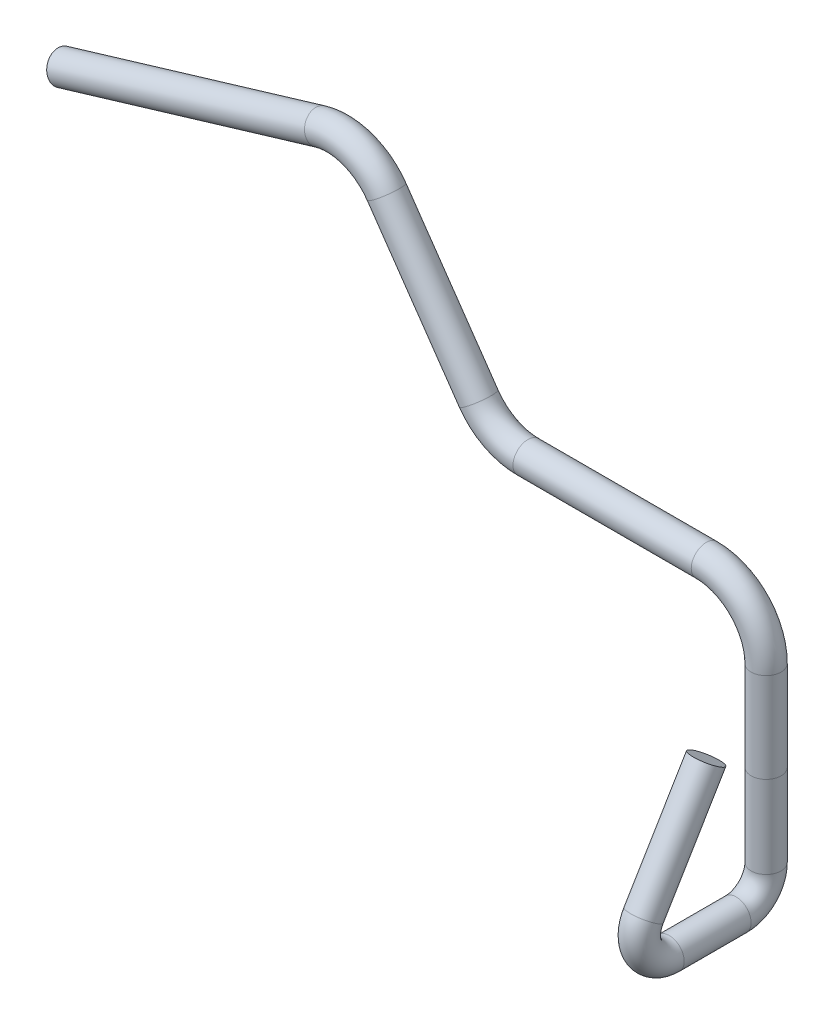
ISO-10303-21;
HEADER;
FILE_DESCRIPTION(('STEP AP214'),'2;1');
FILE_NAME('part.step','',(''),(''),'','','');
FILE_SCHEMA(('AUTOMOTIVE_DESIGN { 1 0 10303 214 1 1 1 1 }'));
ENDSEC;
DATA;
#1=APPLICATION_CONTEXT('core data for automotive mechanical design processes');
#2=APPLICATION_PROTOCOL_DEFINITION('international standard','automotive_design',2000,#1);
#3=PRODUCT_CONTEXT('',#1,'mechanical');
#4=PRODUCT('Part','Part','',(#3));
#5=PRODUCT_RELATED_PRODUCT_CATEGORY('part','',(#4));
#6=PRODUCT_DEFINITION_FORMATION('','',#4);
#7=PRODUCT_DEFINITION_CONTEXT('part definition',#1,'design');
#8=PRODUCT_DEFINITION('design','',#6,#7);
#9=PRODUCT_DEFINITION_SHAPE('','',#8);
#10=(LENGTH_UNIT() NAMED_UNIT(*) SI_UNIT(.MILLI.,.METRE.));
#11=(NAMED_UNIT(*) PLANE_ANGLE_UNIT() SI_UNIT($,.RADIAN.));
#12=(NAMED_UNIT(*) SI_UNIT($,.STERADIAN.) SOLID_ANGLE_UNIT());
#13=UNCERTAINTY_MEASURE_WITH_UNIT(LENGTH_MEASURE(1.E-05),#10,'distance_accuracy_value','');
#14=(GEOMETRIC_REPRESENTATION_CONTEXT(3) GLOBAL_UNCERTAINTY_ASSIGNED_CONTEXT((#13)) GLOBAL_UNIT_ASSIGNED_CONTEXT((#10,
#11,#12)) REPRESENTATION_CONTEXT('',''));
#15=CARTESIAN_POINT('',(0.,0.,0.));
#16=DIRECTION('',(0.,0.,1.));
#17=DIRECTION('',(1.,0.,0.));
#18=AXIS2_PLACEMENT_3D('',#15,#16,#17);
#19=CARTESIAN_POINT('',(-119.38,43.18,0.));
#20=DIRECTION('',(-0.957826285221151,-0.287347885566345,0.));
#21=DIRECTION('',(0.,0.,1.));
#22=AXIS2_PLACEMENT_3D('',#19,#20,#21);
#23=PLANE('',#22);
#24=CARTESIAN_POINT('',(-119.38,43.18,0.));
#25=DIRECTION('',(-0.957826285221151,-0.287347885566345,0.));
#26=DIRECTION('',(0.,0.,1.));
#27=AXIS2_PLACEMENT_3D('',#24,#25,#26);
#28=CIRCLE('',#27,2.54);
#29=CARTESIAN_POINT('',(-120.109863629338,45.6128787644617,0.));
#30=VERTEX_POINT('',#29);
#31=EDGE_CURVE('E118',#30,#30,#28,.T.);
#32=ORIENTED_EDGE('',*,*,#31,.T.);
#33=EDGE_LOOP('',(#32));
#34=FACE_BOUND('',#33,.T.);
#35=ADVANCED_FACE('F61',(#34),#23,.T.);
#36=CARTESIAN_POINT('',(0.,6.35,10.16));
#37=DIRECTION('',(0.,-0.857492925712544,0.514495755427527));
#38=DIRECTION('',(0.,-0.514495755427527,-0.857492925712544));
#39=AXIS2_PLACEMENT_3D('',#36,#37,#38);
#40=PLANE('',#39);
#41=CARTESIAN_POINT('',(0.,6.35,10.16));
#42=DIRECTION('',(0.,-0.857492925712544,0.514495755427527));
#43=DIRECTION('',(0.,-0.514495755427527,-0.857492925712544));
#44=AXIS2_PLACEMENT_3D('',#41,#42,#43);
#45=CIRCLE('',#44,2.54);
#46=CARTESIAN_POINT('',(0.,5.04318078121408,7.98196796869014));
#47=VERTEX_POINT('',#46);
#48=EDGE_CURVE('E11',#47,#47,#45,.T.);
#49=ORIENTED_EDGE('',*,*,#48,.F.);
#50=EDGE_LOOP('',(#49));
#51=FACE_BOUND('',#50,.T.);
#52=ADVANCED_FACE('F128',(#51),#40,.F.);
#53=CARTESIAN_POINT('',(-119.38,43.18,0.));
#54=DIRECTION('',(0.957826285221151,0.287347885566345,0.));
#55=DIRECTION('',(-0.287347885566345,0.957826285221151,0.));
#56=AXIS2_PLACEMENT_3D('',#53,#54,#55);
#57=CYLINDRICAL_SURFACE('',#56,2.54);
#58=CARTESIAN_POINT('',(-75.6508903402252,56.2987328979324,0.));
#59=DIRECTION('',(-0.957826285221151,-0.287347885566345,0.));
#60=DIRECTION('',(0.,0.,1.));
#61=AXIS2_PLACEMENT_3D('',#58,#59,#60);
#62=CIRCLE('',#61,2.54);
#63=CARTESIAN_POINT('',(-76.3807539695637,58.7316116623942,0.));
#64=VERTEX_POINT('',#63);
#65=EDGE_CURVE('E114',#64,#64,#62,.T.);
#66=CARTESIAN_POINT('',(-76.3807539695637,58.7316116623942,0.));
#67=CARTESIAN_POINT('',(-76.8362655285197,58.5949581947074,0.));
#68=CARTESIAN_POINT('',(-77.2917770874757,58.4583047270206,0.));
#69=CARTESIAN_POINT('',(-78.2028002053877,58.184997791647,0.));
#70=CARTESIAN_POINT('',(-78.6583117643437,58.0483443239602,0.));
#71=CARTESIAN_POINT('',(-79.5693348822556,57.7750373885866,0.));
#72=CARTESIAN_POINT('',(-80.0248464412116,57.6383839208998,0.));
#73=CARTESIAN_POINT('',(-80.9358695591236,57.3650769855262,0.));
#74=CARTESIAN_POINT('',(-81.3913811180796,57.2284235178394,0.));
#75=CARTESIAN_POINT('',(-82.3024042359915,56.9551165824658,0.));
#76=CARTESIAN_POINT('',(-82.7579157949475,56.818463114779,0.));
#77=CARTESIAN_POINT('',(-83.6689389128595,56.5451561794054,0.));
#78=CARTESIAN_POINT('',(-84.1244504718155,56.4085027117186,0.));
#79=CARTESIAN_POINT('',(-85.0354735897275,56.135195776345,0.));
#80=CARTESIAN_POINT('',(-85.4909851486835,55.9985423086582,0.));
#81=CARTESIAN_POINT('',(-86.4020082665954,55.7252353732847,0.));
#82=CARTESIAN_POINT('',(-86.8575198255514,55.5885819055978,0.));
#83=CARTESIAN_POINT('',(-87.7685429434634,55.3152749702243,0.));
#84=CARTESIAN_POINT('',(-88.2240545024194,55.1786215025375,0.));
#85=CARTESIAN_POINT('',(-89.1350776203313,54.9053145671639,0.));
#86=CARTESIAN_POINT('',(-89.5905891792873,54.7686610994771,0.));
#87=CARTESIAN_POINT('',(-90.5016122971993,54.4953541641035,0.));
#88=CARTESIAN_POINT('',(-90.9571238561553,54.3587006964167,0.));
#89=CARTESIAN_POINT('',(-91.8681469740673,54.0853937610431,0.));
#90=CARTESIAN_POINT('',(-92.3236585330233,53.9487402933563,0.));
#91=CARTESIAN_POINT('',(-93.2346816509352,53.6754333579827,0.));
#92=CARTESIAN_POINT('',(-93.6901932098912,53.5387798902959,0.));
#93=CARTESIAN_POINT('',(-94.6012163278032,53.2654729549223,0.));
#94=CARTESIAN_POINT('',(-95.0567278867592,53.1288194872355,0.));
#95=CARTESIAN_POINT('',(-95.9677510046712,52.8555125518619,0.));
#96=CARTESIAN_POINT('',(-96.4232625636271,52.7188590841751,0.));
#97=CARTESIAN_POINT('',(-97.3342856815391,52.4455521488015,0.));
#98=CARTESIAN_POINT('',(-97.7897972404951,52.3088986811147,0.));
#99=CARTESIAN_POINT('',(-98.7008203584071,52.0355917457412,0.));
#100=CARTESIAN_POINT('',(-99.1563319173631,51.8989382780544,0.));
#101=CARTESIAN_POINT('',(-100.067355035275,51.6256313426808,0.));
#102=CARTESIAN_POINT('',(-100.522866594231,51.488977874994,0.));
#103=CARTESIAN_POINT('',(-101.433889712143,51.2156709396204,0.));
#104=CARTESIAN_POINT('',(-101.889401271099,51.0790174719336,0.));
#105=CARTESIAN_POINT('',(-102.800424389011,50.80571053656,0.));
#106=CARTESIAN_POINT('',(-103.255935947967,50.6690570688732,0.));
#107=CARTESIAN_POINT('',(-104.166959065879,50.3957501334996,0.));
#108=CARTESIAN_POINT('',(-104.622470624835,50.2590966658128,0.));
#109=CARTESIAN_POINT('',(-105.533493742747,49.9857897304392,0.));
#110=CARTESIAN_POINT('',(-105.989005301703,49.8491362627524,0.));
#111=CARTESIAN_POINT('',(-106.900028419615,49.5758293273788,0.));
#112=CARTESIAN_POINT('',(-107.355539978571,49.439175859692,0.));
#113=CARTESIAN_POINT('',(-108.266563096483,49.1658689243184,0.));
#114=CARTESIAN_POINT('',(-108.722074655439,49.0292154566316,0.));
#115=CARTESIAN_POINT('',(-109.633097773351,48.755908521258,0.));
#116=CARTESIAN_POINT('',(-110.088609332307,48.6192550535712,0.));
#117=CARTESIAN_POINT('',(-110.999632450219,48.3459481181977,0.));
#118=CARTESIAN_POINT('',(-111.455144009175,48.2092946505109,0.));
#119=CARTESIAN_POINT('',(-112.366167127087,47.9359877151373,0.));
#120=CARTESIAN_POINT('',(-112.821678686043,47.7993342474505,0.));
#121=CARTESIAN_POINT('',(-113.732701803955,47.5260273120769,0.));
#122=CARTESIAN_POINT('',(-114.188213362911,47.3893738443901,0.));
#123=CARTESIAN_POINT('',(-115.099236480823,47.1160669090165,0.));
#124=CARTESIAN_POINT('',(-115.554748039779,46.9794134413297,0.));
#125=CARTESIAN_POINT('',(-116.465771157691,46.7061065059561,0.));
#126=CARTESIAN_POINT('',(-116.921282716647,46.5694530382693,0.));
#127=CARTESIAN_POINT('',(-117.832305834559,46.2961461028957,0.));
#128=CARTESIAN_POINT('',(-118.287817393515,46.1594926352089,0.));
#129=CARTESIAN_POINT('',(-119.198840511427,45.8861856998353,0.));
#130=CARTESIAN_POINT('',(-119.654352070383,45.7495322321485,0.));
#131=CARTESIAN_POINT('',(-120.109863629338,45.6128787644617,0.));
#132=B_SPLINE_CURVE_WITH_KNOTS('',3,(#66,#67,#68,#69,#70,#71,#72,#73,#74,#75,#76,#77,#78,#79,
#80,#81,#82,#83,#84,#85,#86,#87,#88,#89,#90,#91,#92,#93,#94,#95,#96,#97,#98,#99,#100,#101,#102,
#103,#104,#105,#106,#107,#108,#109,#110,#111,#112,#113,#114,#115,#116,#117,#118,#119,#120,#121,
#122,#123,#124,#125,#126,#127,#128,#129,#130,#131),.UNSPECIFIED.,.F.,.F.,(4,2,2,2,2,2,2,2,2,2,2,
2,2,2,2,2,2,2,2,2,2,2,2,2,2,2,2,2,2,2,2,2,4),(0.,1.42670408815566,2.85340817631132,
4.28011226446697,5.70681635262263,7.13352044077829,8.56022452893394,9.9869286170896,
11.4136327052453,12.8403367934009,14.2670408815566,15.6937449697122,17.1204490578679,
18.5471531460235,19.9738572341792,21.4005613223348,22.8272654104905,24.2539694986462,
25.6806735868018,27.1073776749575,28.5340817631131,29.9607858512688,31.3874899394244,
32.8141940275801,34.2408981157358,35.6676022038914,37.0943062920471,38.5210103802027,
39.9477144683584,41.374418556514,42.8011226446697,44.2278267328253,45.654530820981),.UNSPECIFIED.);
#133=EDGE_CURVE('BSEAM125',#64,#30,#132,.T.);
#134=ORIENTED_EDGE('',*,*,#65,.T.);
#135=ORIENTED_EDGE('',*,*,#31,.F.);
#136=ORIENTED_EDGE('',*,*,#133,.T.);
#137=ORIENTED_EDGE('',*,*,#133,.F.);
#138=EDGE_LOOP('',(#134,#136,#135,#137));
#139=FACE_BOUND('',#138,.T.);
#140=ADVANCED_FACE('F125',(#139),#57,.T.);
#141=CARTESIAN_POINT('',(-72.7314358228711,46.5672178400856,0.));
#142=DIRECTION('',(0.,0.,-1.));
#143=DIRECTION('',(-1.,0.,0.));
#144=AXIS2_PLACEMENT_3D('',#141,#142,#143);
#145=TOROIDAL_SURFACE('',#144,10.16,2.54);
#146=CARTESIAN_POINT('',(-64.3779631557703,52.3503912250014,0.));
#147=DIRECTION('',(-0.569209978830304,0.822192191643782,0.));
#148=DIRECTION('',(0.,0.,1.));
#149=AXIS2_PLACEMENT_3D('',#146,#147,#148);
#150=CIRCLE('',#149,2.54);
#151=CARTESIAN_POINT('',(-62.289594988995,53.7961845712304,0.));
#152=VERTEX_POINT('',#151);
#153=EDGE_CURVE('E110',#152,#152,#150,.T.);
#154=CARTESIAN_POINT('',(-72.7314358228711,46.5672178400856,0.));
#155=DIRECTION('',(0.,0.,-1.));
#156=DIRECTION('',(-1.,0.,0.));
#157=AXIS2_PLACEMENT_3D('',#154,#155,#156);
#158=CIRCLE('',#157,12.7);
#159=EDGE_CURVE('',#64,#152,#158,.T.);
#160=ORIENTED_EDGE('',*,*,#65,.F.);
#161=ORIENTED_EDGE('',*,*,#153,.T.);
#162=ORIENTED_EDGE('',*,*,#159,.T.);
#163=ORIENTED_EDGE('',*,*,#159,.F.);
#164=EDGE_LOOP('',(#160,#162,#161,#163));
#165=FACE_BOUND('',#164,.T.);
#166=ADVANCED_FACE('F127',(#165),#145,.T.);
#167=CARTESIAN_POINT('',(-64.3779631557703,52.3503912250014,0.));
#168=DIRECTION('',(0.569209978830309,-0.822192191643778,0.));
#169=DIRECTION('',(0.822192191643778,0.569209978830309,0.));
#170=AXIS2_PLACEMENT_3D('',#167,#168,#169);
#171=CYLINDRICAL_SURFACE('',#170,2.54);
#172=CARTESIAN_POINT('',(-48.7501107335198,29.7768266150841,0.));
#173=DIRECTION('',(-0.569209978830309,0.822192191643778,0.));
#174=DIRECTION('',(0.,0.,1.));
#175=AXIS2_PLACEMENT_3D('',#172,#173,#174);
#176=CIRCLE('',#175,2.54);
#177=CARTESIAN_POINT('',(-50.838478900295,28.3310332688551,0.));
#178=VERTEX_POINT('',#177);
#179=EDGE_CURVE('E106',#178,#178,#176,.T.);
#180=ORIENTED_EDGE('',*,*,#179,.T.);
#181=EDGE_LOOP('',(#180));
#182=FACE_BOUND('',#181,.T.);
#183=ORIENTED_EDGE('',*,*,#153,.F.);
#184=EDGE_LOOP('',(#183));
#185=FACE_BOUND('',#184,.T.);
#186=ADVANCED_FACE('F135',(#182,#185),#171,.T.);
#187=CARTESIAN_POINT('',(-40.396638066419,35.56,0.));
#188=DIRECTION('',(0.,0.,1.));
#189=DIRECTION('',(1.,0.,0.));
#190=AXIS2_PLACEMENT_3D('',#187,#188,#189);
#191=TOROIDAL_SURFACE('',#190,10.16,2.54);
#192=CARTESIAN_POINT('',(-40.3966380664189,25.4,0.));
#193=DIRECTION('',(-1.,0.,0.));
#194=DIRECTION('',(0.,0.,1.));
#195=AXIS2_PLACEMENT_3D('',#192,#193,#194);
#196=CIRCLE('',#195,2.54);
#197=CARTESIAN_POINT('',(-40.3966380664189,22.86,0.));
#198=VERTEX_POINT('',#197);
#199=EDGE_CURVE('E102',#198,#198,#196,.T.);
#200=CARTESIAN_POINT('',(-40.396638066419,35.56,0.));
#201=DIRECTION('',(0.,0.,1.));
#202=DIRECTION('',(1.,0.,0.));
#203=AXIS2_PLACEMENT_3D('',#200,#201,#202);
#204=CIRCLE('',#203,12.7);
#205=EDGE_CURVE('',#178,#198,#204,.T.);
#206=ORIENTED_EDGE('',*,*,#179,.F.);
#207=ORIENTED_EDGE('',*,*,#199,.T.);
#208=ORIENTED_EDGE('',*,*,#205,.T.);
#209=ORIENTED_EDGE('',*,*,#205,.F.);
#210=EDGE_LOOP('',(#206,#208,#207,#209));
#211=FACE_BOUND('',#210,.T.);
#212=ADVANCED_FACE('F172',(#211),#191,.T.);
#213=CARTESIAN_POINT('',(-40.3966380664189,25.4,0.));
#214=DIRECTION('',(1.,0.,0.));
#215=DIRECTION('',(0.,1.,0.));
#216=AXIS2_PLACEMENT_3D('',#213,#214,#215);
#217=CYLINDRICAL_SURFACE('',#216,2.54);
#218=CARTESIAN_POINT('',(-10.1600000000001,25.4,0.));
#219=DIRECTION('',(-1.,0.,0.));
#220=DIRECTION('',(0.,0.,1.));
#221=AXIS2_PLACEMENT_3D('',#218,#219,#220);
#222=CIRCLE('',#221,2.54);
#223=CARTESIAN_POINT('',(-10.1600000000001,27.94,0.));
#224=VERTEX_POINT('',#223);
#225=EDGE_CURVE('E98',#224,#224,#222,.T.);
#226=ORIENTED_EDGE('',*,*,#225,.T.);
#227=EDGE_LOOP('',(#226));
#228=FACE_BOUND('',#227,.T.);
#229=ORIENTED_EDGE('',*,*,#199,.F.);
#230=EDGE_LOOP('',(#229));
#231=FACE_BOUND('',#230,.T.);
#232=ADVANCED_FACE('F168',(#228,#231),#217,.T.);
#233=CARTESIAN_POINT('',(-10.16,15.24,0.));
#234=DIRECTION('',(0.,0.,-1.));
#235=DIRECTION('',(-1.,0.,0.));
#236=AXIS2_PLACEMENT_3D('',#233,#234,#235);
#237=TOROIDAL_SURFACE('',#236,10.16,2.54);
#238=CARTESIAN_POINT('',(0.,15.24,0.));
#239=DIRECTION('',(0.,1.,0.));
#240=DIRECTION('',(0.,0.,1.));
#241=AXIS2_PLACEMENT_3D('',#238,#239,#240);
#242=CIRCLE('',#241,2.54);
#243=CARTESIAN_POINT('',(2.54,15.24,0.));
#244=VERTEX_POINT('',#243);
#245=EDGE_CURVE('E94',#244,#244,#242,.T.);
#246=CARTESIAN_POINT('',(-10.16,15.24,0.));
#247=DIRECTION('',(0.,0.,-1.));
#248=DIRECTION('',(-1.,0.,0.));
#249=AXIS2_PLACEMENT_3D('',#246,#247,#248);
#250=CIRCLE('',#249,12.7);
#251=EDGE_CURVE('',#224,#244,#250,.T.);
#252=ORIENTED_EDGE('',*,*,#225,.F.);
#253=ORIENTED_EDGE('',*,*,#245,.T.);
#254=ORIENTED_EDGE('',*,*,#251,.T.);
#255=ORIENTED_EDGE('',*,*,#251,.F.);
#256=EDGE_LOOP('',(#252,#254,#253,#255));
#257=FACE_BOUND('',#256,.T.);
#258=ADVANCED_FACE('F164',(#257),#237,.T.);
#259=CARTESIAN_POINT('',(0.,15.24,0.));
#260=DIRECTION('',(0.,-1.,0.));
#261=DIRECTION('',(0.,0.,-1.));
#262=AXIS2_PLACEMENT_3D('',#259,#260,#261);
#263=CYLINDRICAL_SURFACE('',#262,2.54);
#264=CARTESIAN_POINT('',(0.,0.,0.));
#265=DIRECTION('',(0.,1.,0.));
#266=DIRECTION('',(0.,0.,1.));
#267=AXIS2_PLACEMENT_3D('',#264,#265,#266);
#268=CIRCLE('',#267,2.54);
#269=CARTESIAN_POINT('',(0.,0.,2.54));
#270=VERTEX_POINT('',#269);
#271=EDGE_CURVE('E90',#270,#270,#268,.T.);
#272=ORIENTED_EDGE('',*,*,#271,.T.);
#273=EDGE_LOOP('',(#272));
#274=FACE_BOUND('',#273,.T.);
#275=ORIENTED_EDGE('',*,*,#245,.F.);
#276=EDGE_LOOP('',(#275));
#277=FACE_BOUND('',#276,.T.);
#278=ADVANCED_FACE('F160',(#274,#277),#263,.T.);
#279=CARTESIAN_POINT('',(0.,0.,0.));
#280=DIRECTION('',(0.,-1.,0.));
#281=DIRECTION('',(0.,0.,-1.));
#282=AXIS2_PLACEMENT_3D('',#279,#280,#281);
#283=CYLINDRICAL_SURFACE('',#282,2.54);
#284=CARTESIAN_POINT('',(0.,-13.97,0.));
#285=DIRECTION('',(0.,1.,0.));
#286=DIRECTION('',(0.,0.,1.));
#287=AXIS2_PLACEMENT_3D('',#284,#285,#286);
#288=CIRCLE('',#287,2.54);
#289=CARTESIAN_POINT('',(0.,-13.9699999999999,-2.54));
#290=VERTEX_POINT('',#289);
#291=EDGE_CURVE('E86',#290,#290,#288,.T.);
#292=ORIENTED_EDGE('',*,*,#291,.T.);
#293=EDGE_LOOP('',(#292));
#294=FACE_BOUND('',#293,.T.);
#295=ORIENTED_EDGE('',*,*,#271,.F.);
#296=EDGE_LOOP('',(#295));
#297=FACE_BOUND('',#296,.T.);
#298=ADVANCED_FACE('F156',(#294,#297),#283,.T.);
#299=CARTESIAN_POINT('',(0.,-13.97,5.08));
#300=DIRECTION('',(-1.,0.,0.));
#301=DIRECTION('',(0.,0.,1.));
#302=AXIS2_PLACEMENT_3D('',#299,#300,#301);
#303=TOROIDAL_SURFACE('',#302,5.08,2.54);
#304=CARTESIAN_POINT('',(0.,-19.05,5.08000000000003));
#305=DIRECTION('',(0.,0.,-1.));
#306=DIRECTION('',(0.,1.,0.));
#307=AXIS2_PLACEMENT_3D('',#304,#305,#306);
#308=CIRCLE('',#307,2.54);
#309=CARTESIAN_POINT('',(0.,-21.59,5.08000000000005));
#310=VERTEX_POINT('',#309);
#311=EDGE_CURVE('E80',#310,#310,#308,.T.);
#312=CARTESIAN_POINT('',(0.,-13.97,5.08));
#313=DIRECTION('',(-1.,0.,0.));
#314=DIRECTION('',(0.,0.,1.));
#315=AXIS2_PLACEMENT_3D('',#312,#313,#314);
#316=CIRCLE('',#315,7.62);
#317=EDGE_CURVE('',#290,#310,#316,.T.);
#318=ORIENTED_EDGE('',*,*,#291,.F.);
#319=ORIENTED_EDGE('',*,*,#311,.T.);
#320=ORIENTED_EDGE('',*,*,#317,.T.);
#321=ORIENTED_EDGE('',*,*,#317,.F.);
#322=EDGE_LOOP('',(#318,#320,#319,#321));
#323=FACE_BOUND('',#322,.T.);
#324=ADVANCED_FACE('F152',(#323),#303,.T.);
#325=CARTESIAN_POINT('',(0.,-19.05,5.08000000000003));
#326=DIRECTION('',(0.,0.,1.));
#327=DIRECTION('',(1.,0.,0.));
#328=AXIS2_PLACEMENT_3D('',#325,#326,#327);
#329=CYLINDRICAL_SURFACE('',#328,2.54);
#330=CARTESIAN_POINT('',(0.,-19.05,16.4277528748371));
#331=DIRECTION('',(0.,0.,-1.));
#332=DIRECTION('',(0.,1.,0.));
#333=AXIS2_PLACEMENT_3D('',#330,#331,#332);
#334=CIRCLE('',#333,2.54);
#335=CARTESIAN_POINT('',(0.,-21.59,16.4277528748371));
#336=VERTEX_POINT('',#335);
#337=EDGE_CURVE('E74',#336,#336,#334,.T.);
#338=ORIENTED_EDGE('',*,*,#337,.T.);
#339=EDGE_LOOP('',(#338));
#340=FACE_BOUND('',#339,.T.);
#341=ORIENTED_EDGE('',*,*,#311,.F.);
#342=EDGE_LOOP('',(#341));
#343=FACE_BOUND('',#342,.T.);
#344=ADVANCED_FACE('F146',(#340,#343),#329,.T.);
#345=CARTESIAN_POINT('',(0.,-13.97,16.4277528748372));
#346=DIRECTION('',(-1.,0.,0.));
#347=DIRECTION('',(0.,0.,1.));
#348=AXIS2_PLACEMENT_3D('',#345,#346,#347);
#349=TOROIDAL_SURFACE('',#348,5.08,2.54);
#350=CARTESIAN_POINT('',(0.,-11.3563615624283,20.783816937457));
#351=DIRECTION('',(0.,-0.857492925712544,0.514495755427527));
#352=DIRECTION('',(0.,-0.514495755427527,-0.857492925712544));
#353=AXIS2_PLACEMENT_3D('',#350,#351,#352);
#354=CIRCLE('',#353,2.54);
#355=CARTESIAN_POINT('',(0.,-10.0495423436424,22.9618489687668));
#356=VERTEX_POINT('',#355);
#357=EDGE_CURVE('E68',#356,#356,#354,.T.);
#358=CARTESIAN_POINT('',(0.,-13.97,16.4277528748372));
#359=DIRECTION('',(-1.,0.,0.));
#360=DIRECTION('',(0.,0.,1.));
#361=AXIS2_PLACEMENT_3D('',#358,#359,#360);
#362=CIRCLE('',#361,7.62);
#363=EDGE_CURVE('',#336,#356,#362,.T.);
#364=ORIENTED_EDGE('',*,*,#337,.F.);
#365=ORIENTED_EDGE('',*,*,#357,.T.);
#366=ORIENTED_EDGE('',*,*,#363,.T.);
#367=ORIENTED_EDGE('',*,*,#363,.F.);
#368=EDGE_LOOP('',(#364,#366,#365,#367));
#369=FACE_BOUND('',#368,.T.);
#370=ADVANCED_FACE('F141',(#369),#349,.T.);
#371=CARTESIAN_POINT('',(0.,-11.3563615624281,20.7838169374569));
#372=DIRECTION('',(0.,0.857492925712544,-0.514495755427526));
#373=DIRECTION('',(0.,0.514495755427526,0.857492925712544));
#374=AXIS2_PLACEMENT_3D('',#371,#372,#373);
#375=CYLINDRICAL_SURFACE('',#374,2.54);
#376=ORIENTED_EDGE('',*,*,#48,.T.);
#377=EDGE_LOOP('',(#376));
#378=FACE_BOUND('',#377,.T.);
#379=ORIENTED_EDGE('',*,*,#357,.F.);
#380=EDGE_LOOP('',(#379));
#381=FACE_BOUND('',#380,.T.);
#382=ADVANCED_FACE('F139',(#378,#381),#375,.T.);
#383=CLOSED_SHELL('',(#35,#52,#140,#166,#186,#212,#232,#258,#278,#298,#324,#344,#370,#382));
#384=MANIFOLD_SOLID_BREP('B2',#383);
#385=ADVANCED_BREP_SHAPE_REPRESENTATION('',(#18,#384),#14);
#386=SHAPE_DEFINITION_REPRESENTATION(#9,#385);
ENDSEC;
END-ISO-10303-21;
